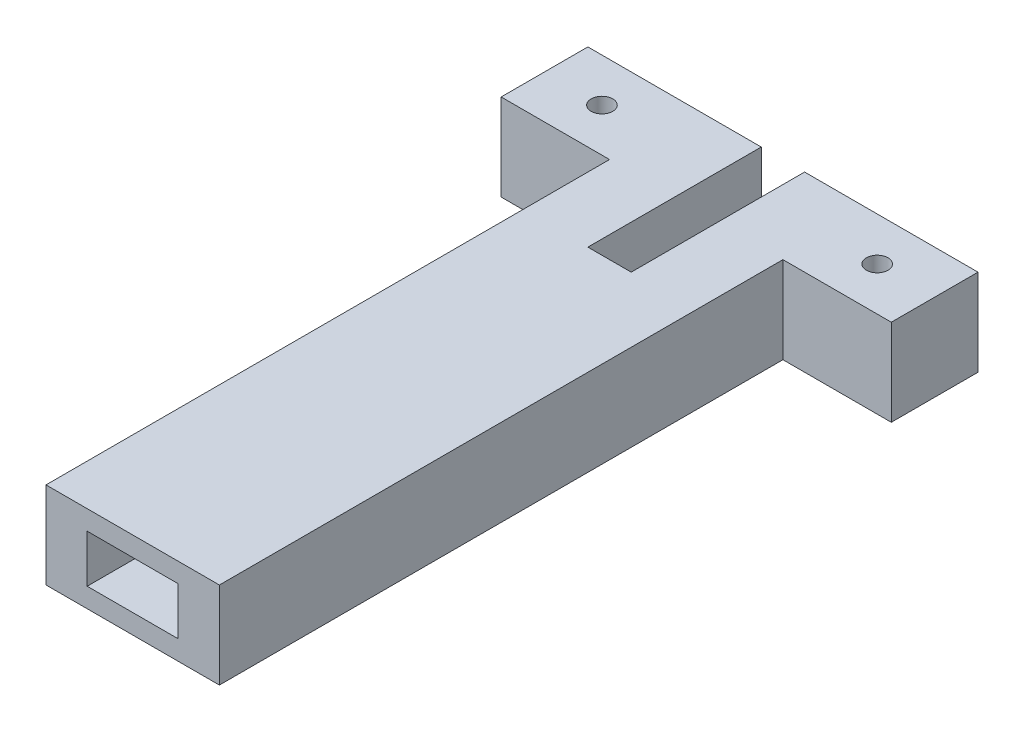
ISO-10303-21;
HEADER;
FILE_DESCRIPTION(('STEP AP214'),'2;1');
FILE_NAME('part.step','',(''),(''),'','','');
FILE_SCHEMA(('AUTOMOTIVE_DESIGN { 1 0 10303 214 1 1 1 1 }'));
ENDSEC;
DATA;
#1=APPLICATION_CONTEXT('core data for automotive mechanical design processes');
#2=APPLICATION_PROTOCOL_DEFINITION('international standard','automotive_design',2000,#1);
#3=PRODUCT_CONTEXT('',#1,'mechanical');
#4=PRODUCT('Part','Part','',(#3));
#5=PRODUCT_RELATED_PRODUCT_CATEGORY('part','',(#4));
#6=PRODUCT_DEFINITION_FORMATION('','',#4);
#7=PRODUCT_DEFINITION_CONTEXT('part definition',#1,'design');
#8=PRODUCT_DEFINITION('design','',#6,#7);
#9=PRODUCT_DEFINITION_SHAPE('','',#8);
#10=(LENGTH_UNIT() NAMED_UNIT(*) SI_UNIT(.MILLI.,.METRE.));
#11=(NAMED_UNIT(*) PLANE_ANGLE_UNIT() SI_UNIT($,.RADIAN.));
#12=(NAMED_UNIT(*) SI_UNIT($,.STERADIAN.) SOLID_ANGLE_UNIT());
#13=UNCERTAINTY_MEASURE_WITH_UNIT(LENGTH_MEASURE(1.E-05),#10,'distance_accuracy_value','');
#14=(GEOMETRIC_REPRESENTATION_CONTEXT(3) GLOBAL_UNCERTAINTY_ASSIGNED_CONTEXT((#13)) GLOBAL_UNIT_ASSIGNED_CONTEXT((#10,
#11,#12)) REPRESENTATION_CONTEXT('',''));
#15=CARTESIAN_POINT('',(0.,0.,0.));
#16=DIRECTION('',(0.,0.,1.));
#17=DIRECTION('',(1.,0.,0.));
#18=AXIS2_PLACEMENT_3D('',#15,#16,#17);
#19=CARTESIAN_POINT('',(-2.5,10.,15.));
#20=DIRECTION('',(0.,0.,1.));
#21=DIRECTION('',(1.,0.,0.));
#22=AXIS2_PLACEMENT_3D('',#19,#20,#21);
#23=PLANE('',#22);
#24=DIRECTION('',(0.,-1.,0.));
#25=VECTOR('',#24,1.);
#26=CARTESIAN_POINT('',(-2.5,10.,15.));
#27=LINE('',#26,#25);
#28=CARTESIAN_POINT('',(-2.5,2.25,15.));
#29=VERTEX_POINT('',#28);
#30=CARTESIAN_POINT('',(-2.5,0.,15.));
#31=VERTEX_POINT('',#30);
#32=EDGE_CURVE('E342',#29,#31,#27,.T.);
#33=ORIENTED_EDGE('',*,*,#32,.F.);
#34=DIRECTION('',(-1.,0.,0.));
#35=VECTOR('',#34,1.);
#36=CARTESIAN_POINT('',(-5.25,2.25,15.));
#37=LINE('',#36,#35);
#38=CARTESIAN_POINT('',(2.5,2.25,15.));
#39=VERTEX_POINT('',#38);
#40=EDGE_CURVE('E55',#39,#29,#37,.T.);
#41=ORIENTED_EDGE('',*,*,#40,.F.);
#42=DIRECTION('',(0.,-1.,0.));
#43=VECTOR('',#42,1.);
#44=CARTESIAN_POINT('',(2.5,10.,15.));
#45=LINE('',#44,#43);
#46=CARTESIAN_POINT('',(2.5,0.,15.));
#47=VERTEX_POINT('',#46);
#48=EDGE_CURVE('E346',#39,#47,#45,.T.);
#49=ORIENTED_EDGE('',*,*,#48,.T.);
#50=DIRECTION('',(-1.,0.,0.));
#51=VECTOR('',#50,1.);
#52=CARTESIAN_POINT('',(-2.5,0.,15.));
#53=LINE('',#52,#51);
#54=EDGE_CURVE('E277',#47,#31,#53,.T.);
#55=ORIENTED_EDGE('',*,*,#54,.T.);
#56=EDGE_LOOP('',(#33,#41,#49,#55));
#57=FACE_BOUND('',#56,.T.);
#58=ADVANCED_FACE('F39',(#57),#23,.F.);
#59=CARTESIAN_POINT('',(0.,10.,0.));
#60=DIRECTION('',(0.,1.,0.));
#61=DIRECTION('',(0.,0.,1.));
#62=AXIS2_PLACEMENT_3D('',#59,#60,#61);
#63=PLANE('',#62);
#64=CARTESIAN_POINT('',(-15.875,10.,0.));
#65=DIRECTION('',(0.,1.,0.));
#66=DIRECTION('',(0.,0.,1.));
#67=AXIS2_PLACEMENT_3D('',#64,#65,#66);
#68=CIRCLE('',#67,1.25);
#69=CARTESIAN_POINT('',(-15.875,10.,1.25));
#70=VERTEX_POINT('',#69);
#71=EDGE_CURVE('E223',#70,#70,#68,.T.);
#72=ORIENTED_EDGE('',*,*,#71,.F.);
#73=EDGE_LOOP('',(#72));
#74=FACE_BOUND('',#73,.T.);
#75=DIRECTION('',(-1.,0.,0.));
#76=VECTOR('',#75,1.);
#77=CARTESIAN_POINT('',(2.5,10.,-5.));
#78=LINE('',#77,#76);
#79=CARTESIAN_POINT('',(22.5,10.,-5.));
#80=VERTEX_POINT('',#79);
#81=CARTESIAN_POINT('',(2.5,10.,-5.));
#82=VERTEX_POINT('',#81);
#83=EDGE_CURVE('E231',#80,#82,#78,.T.);
#84=ORIENTED_EDGE('',*,*,#83,.T.);
#85=DIRECTION('',(0.,0.,1.));
#86=VECTOR('',#85,1.);
#87=CARTESIAN_POINT('',(2.5,10.,15.));
#88=LINE('',#87,#86);
#89=CARTESIAN_POINT('',(2.5,10.,15.));
#90=VERTEX_POINT('',#89);
#91=EDGE_CURVE('E235',#82,#90,#88,.T.);
#92=ORIENTED_EDGE('',*,*,#91,.T.);
#93=DIRECTION('',(-1.,0.,0.));
#94=VECTOR('',#93,1.);
#95=CARTESIAN_POINT('',(-2.5,10.,15.));
#96=LINE('',#95,#94);
#97=CARTESIAN_POINT('',(-2.5,10.,15.));
#98=VERTEX_POINT('',#97);
#99=EDGE_CURVE('E239',#90,#98,#96,.T.);
#100=ORIENTED_EDGE('',*,*,#99,.T.);
#101=DIRECTION('',(0.,0.,-1.));
#102=VECTOR('',#101,1.);
#103=CARTESIAN_POINT('',(-2.5,10.,15.));
#104=LINE('',#103,#102);
#105=CARTESIAN_POINT('',(-2.5,10.,-5.));
#106=VERTEX_POINT('',#105);
#107=EDGE_CURVE('E242',#98,#106,#104,.T.);
#108=ORIENTED_EDGE('',*,*,#107,.T.);
#109=DIRECTION('',(-1.,0.,0.));
#110=VECTOR('',#109,1.);
#111=CARTESIAN_POINT('',(-22.5,10.,-5.));
#112=LINE('',#111,#110);
#113=CARTESIAN_POINT('',(-22.5,10.,-5.));
#114=VERTEX_POINT('',#113);
#115=EDGE_CURVE('E245',#106,#114,#112,.T.);
#116=ORIENTED_EDGE('',*,*,#115,.T.);
#117=DIRECTION('',(0.,0.,1.));
#118=VECTOR('',#117,1.);
#119=CARTESIAN_POINT('',(-22.5,10.,5.));
#120=LINE('',#119,#118);
#121=CARTESIAN_POINT('',(-22.5,10.,5.));
#122=VERTEX_POINT('',#121);
#123=EDGE_CURVE('E248',#114,#122,#120,.T.);
#124=ORIENTED_EDGE('',*,*,#123,.T.);
#125=DIRECTION('',(1.,0.,0.));
#126=VECTOR('',#125,1.);
#127=CARTESIAN_POINT('',(-22.5,10.,5.));
#128=LINE('',#127,#126);
#129=CARTESIAN_POINT('',(-10.,10.,5.));
#130=VERTEX_POINT('',#129);
#131=EDGE_CURVE('E251',#122,#130,#128,.T.);
#132=ORIENTED_EDGE('',*,*,#131,.T.);
#133=DIRECTION('',(0.,0.,1.));
#134=VECTOR('',#133,1.);
#135=CARTESIAN_POINT('',(-10.,10.,70.));
#136=LINE('',#135,#134);
#137=CARTESIAN_POINT('',(-10.,10.,70.));
#138=VERTEX_POINT('',#137);
#139=EDGE_CURVE('E254',#130,#138,#136,.T.);
#140=ORIENTED_EDGE('',*,*,#139,.T.);
#141=DIRECTION('',(1.,0.,0.));
#142=VECTOR('',#141,1.);
#143=CARTESIAN_POINT('',(-10.,10.,70.));
#144=LINE('',#143,#142);
#145=CARTESIAN_POINT('',(10.,10.,70.));
#146=VERTEX_POINT('',#145);
#147=EDGE_CURVE('E257',#138,#146,#144,.T.);
#148=ORIENTED_EDGE('',*,*,#147,.T.);
#149=DIRECTION('',(0.,0.,-1.));
#150=VECTOR('',#149,1.);
#151=CARTESIAN_POINT('',(10.,10.,70.));
#152=LINE('',#151,#150);
#153=CARTESIAN_POINT('',(10.,10.,5.));
#154=VERTEX_POINT('',#153);
#155=EDGE_CURVE('E260',#146,#154,#152,.T.);
#156=ORIENTED_EDGE('',*,*,#155,.T.);
#157=DIRECTION('',(1.,0.,0.));
#158=VECTOR('',#157,1.);
#159=CARTESIAN_POINT('',(10.,10.,5.));
#160=LINE('',#159,#158);
#161=CARTESIAN_POINT('',(22.5,10.,5.));
#162=VERTEX_POINT('',#161);
#163=EDGE_CURVE('E263',#154,#162,#160,.T.);
#164=ORIENTED_EDGE('',*,*,#163,.T.);
#165=DIRECTION('',(0.,0.,-1.));
#166=VECTOR('',#165,1.);
#167=CARTESIAN_POINT('',(22.5,10.,5.));
#168=LINE('',#167,#166);
#169=EDGE_CURVE('E266',#162,#80,#168,.T.);
#170=ORIENTED_EDGE('',*,*,#169,.T.);
#171=EDGE_LOOP('',(#84,#92,#100,#108,#116,#124,#132,#140,#148,#156,#164,#170));
#172=FACE_BOUND('',#171,.T.);
#173=CARTESIAN_POINT('',(15.875,10.,0.));
#174=DIRECTION('',(0.,1.,0.));
#175=DIRECTION('',(0.,0.,1.));
#176=AXIS2_PLACEMENT_3D('',#173,#174,#175);
#177=CIRCLE('',#176,1.25);
#178=CARTESIAN_POINT('',(15.875,10.,1.25));
#179=VERTEX_POINT('',#178);
#180=EDGE_CURVE('E215',#179,#179,#177,.T.);
#181=ORIENTED_EDGE('',*,*,#180,.F.);
#182=EDGE_LOOP('',(#181));
#183=FACE_BOUND('',#182,.T.);
#184=ADVANCED_FACE('F381',(#74,#172,#183),#63,.T.);
#185=CARTESIAN_POINT('',(0.,0.,0.));
#186=DIRECTION('',(0.,1.,0.));
#187=DIRECTION('',(0.,0.,1.));
#188=AXIS2_PLACEMENT_3D('',#185,#186,#187);
#189=PLANE('',#188);
#190=DIRECTION('',(-1.,0.,0.));
#191=VECTOR('',#190,1.);
#192=CARTESIAN_POINT('',(2.5,0.,-5.));
#193=LINE('',#192,#191);
#194=CARTESIAN_POINT('',(22.5,0.,-5.));
#195=VERTEX_POINT('',#194);
#196=CARTESIAN_POINT('',(2.5,0.,-5.));
#197=VERTEX_POINT('',#196);
#198=EDGE_CURVE('E227',#195,#197,#193,.T.);
#199=ORIENTED_EDGE('',*,*,#198,.F.);
#200=DIRECTION('',(0.,0.,-1.));
#201=VECTOR('',#200,1.);
#202=CARTESIAN_POINT('',(22.5,0.,5.));
#203=LINE('',#202,#201);
#204=CARTESIAN_POINT('',(22.5,0.,5.));
#205=VERTEX_POINT('',#204);
#206=EDGE_CURVE('E236',#205,#195,#203,.T.);
#207=ORIENTED_EDGE('',*,*,#206,.F.);
#208=DIRECTION('',(1.,0.,0.));
#209=VECTOR('',#208,1.);
#210=CARTESIAN_POINT('',(10.,0.,5.));
#211=LINE('',#210,#209);
#212=CARTESIAN_POINT('',(10.,0.,5.));
#213=VERTEX_POINT('',#212);
#214=EDGE_CURVE('E302',#213,#205,#211,.T.);
#215=ORIENTED_EDGE('',*,*,#214,.F.);
#216=DIRECTION('',(0.,0.,-1.));
#217=VECTOR('',#216,1.);
#218=CARTESIAN_POINT('',(10.,0.,70.));
#219=LINE('',#218,#217);
#220=CARTESIAN_POINT('',(10.,0.,70.));
#221=VERTEX_POINT('',#220);
#222=EDGE_CURVE('E299',#221,#213,#219,.T.);
#223=ORIENTED_EDGE('',*,*,#222,.F.);
#224=DIRECTION('',(1.,0.,0.));
#225=VECTOR('',#224,1.);
#226=CARTESIAN_POINT('',(-10.,0.,70.));
#227=LINE('',#226,#225);
#228=CARTESIAN_POINT('',(-10.,0.,70.));
#229=VERTEX_POINT('',#228);
#230=EDGE_CURVE('E296',#229,#221,#227,.T.);
#231=ORIENTED_EDGE('',*,*,#230,.F.);
#232=DIRECTION('',(0.,0.,1.));
#233=VECTOR('',#232,1.);
#234=CARTESIAN_POINT('',(-10.,0.,70.));
#235=LINE('',#234,#233);
#236=CARTESIAN_POINT('',(-10.,0.,5.));
#237=VERTEX_POINT('',#236);
#238=EDGE_CURVE('E293',#237,#229,#235,.T.);
#239=ORIENTED_EDGE('',*,*,#238,.F.);
#240=DIRECTION('',(1.,0.,0.));
#241=VECTOR('',#240,1.);
#242=CARTESIAN_POINT('',(-22.5,0.,5.));
#243=LINE('',#242,#241);
#244=CARTESIAN_POINT('',(-22.5,0.,5.));
#245=VERTEX_POINT('',#244);
#246=EDGE_CURVE('E290',#245,#237,#243,.T.);
#247=ORIENTED_EDGE('',*,*,#246,.F.);
#248=DIRECTION('',(0.,0.,1.));
#249=VECTOR('',#248,1.);
#250=CARTESIAN_POINT('',(-22.5,0.,5.));
#251=LINE('',#250,#249);
#252=CARTESIAN_POINT('',(-22.5,0.,-5.));
#253=VERTEX_POINT('',#252);
#254=EDGE_CURVE('E287',#253,#245,#251,.T.);
#255=ORIENTED_EDGE('',*,*,#254,.F.);
#256=DIRECTION('',(-1.,0.,0.));
#257=VECTOR('',#256,1.);
#258=CARTESIAN_POINT('',(-22.5,0.,-5.));
#259=LINE('',#258,#257);
#260=CARTESIAN_POINT('',(-2.5,0.,-5.));
#261=VERTEX_POINT('',#260);
#262=EDGE_CURVE('E284',#261,#253,#259,.T.);
#263=ORIENTED_EDGE('',*,*,#262,.F.);
#264=DIRECTION('',(0.,0.,-1.));
#265=VECTOR('',#264,1.);
#266=CARTESIAN_POINT('',(-2.5,0.,15.));
#267=LINE('',#266,#265);
#268=EDGE_CURVE('E281',#31,#261,#267,.T.);
#269=ORIENTED_EDGE('',*,*,#268,.F.);
#270=ORIENTED_EDGE('',*,*,#54,.F.);
#271=DIRECTION('',(0.,0.,1.));
#272=VECTOR('',#271,1.);
#273=CARTESIAN_POINT('',(2.5,0.,15.));
#274=LINE('',#273,#272);
#275=EDGE_CURVE('E273',#197,#47,#274,.T.);
#276=ORIENTED_EDGE('',*,*,#275,.F.);
#277=EDGE_LOOP('',(#199,#207,#215,#223,#231,#239,#247,#255,#263,#269,#270,#276));
#278=FACE_BOUND('',#277,.T.);
#279=CARTESIAN_POINT('',(-15.875,0.,0.));
#280=DIRECTION('',(0.,1.,0.));
#281=DIRECTION('',(0.,0.,1.));
#282=AXIS2_PLACEMENT_3D('',#279,#280,#281);
#283=CIRCLE('',#282,1.25);
#284=CARTESIAN_POINT('',(-15.875,0.,1.25));
#285=VERTEX_POINT('',#284);
#286=EDGE_CURVE('E219',#285,#285,#283,.T.);
#287=ORIENTED_EDGE('',*,*,#286,.T.);
#288=EDGE_LOOP('',(#287));
#289=FACE_BOUND('',#288,.T.);
#290=CARTESIAN_POINT('',(15.875,0.,0.));
#291=DIRECTION('',(0.,1.,0.));
#292=DIRECTION('',(0.,0.,1.));
#293=AXIS2_PLACEMENT_3D('',#290,#291,#292);
#294=CIRCLE('',#293,1.25);
#295=CARTESIAN_POINT('',(15.875,0.,1.25));
#296=VERTEX_POINT('',#295);
#297=EDGE_CURVE('E214',#296,#296,#294,.T.);
#298=ORIENTED_EDGE('',*,*,#297,.T.);
#299=EDGE_LOOP('',(#298));
#300=FACE_BOUND('',#299,.T.);
#301=ADVANCED_FACE('F366',(#278,#289,#300),#189,.F.);
#302=CARTESIAN_POINT('',(2.5,10.,-5.));
#303=DIRECTION('',(0.,0.,1.));
#304=DIRECTION('',(1.,0.,0.));
#305=AXIS2_PLACEMENT_3D('',#302,#303,#304);
#306=PLANE('',#305);
#307=ORIENTED_EDGE('',*,*,#198,.T.);
#308=DIRECTION('',(0.,-1.,0.));
#309=VECTOR('',#308,1.);
#310=CARTESIAN_POINT('',(2.5,10.,-5.));
#311=LINE('',#310,#309);
#312=EDGE_CURVE('E11',#82,#197,#311,.T.);
#313=ORIENTED_EDGE('',*,*,#312,.F.);
#314=ORIENTED_EDGE('',*,*,#83,.F.);
#315=DIRECTION('',(0.,-1.,0.));
#316=VECTOR('',#315,1.);
#317=CARTESIAN_POINT('',(22.5,10.,-5.));
#318=LINE('',#317,#316);
#319=EDGE_CURVE('E269',#80,#195,#318,.T.);
#320=ORIENTED_EDGE('',*,*,#319,.T.);
#321=EDGE_LOOP('',(#307,#313,#314,#320));
#322=FACE_BOUND('',#321,.T.);
#323=ADVANCED_FACE('F41',(#322),#306,.F.);
#324=CARTESIAN_POINT('',(2.5,10.,15.));
#325=DIRECTION('',(1.,0.,0.));
#326=DIRECTION('',(0.,0.,-1.));
#327=AXIS2_PLACEMENT_3D('',#324,#325,#326);
#328=PLANE('',#327);
#329=ORIENTED_EDGE('',*,*,#275,.T.);
#330=ORIENTED_EDGE('',*,*,#48,.F.);
#331=DIRECTION('',(0.,-1.,0.));
#332=VECTOR('',#331,1.);
#333=CARTESIAN_POINT('',(2.5,10.,15.));
#334=LINE('',#333,#332);
#335=CARTESIAN_POINT('',(2.5,7.75,15.));
#336=VERTEX_POINT('',#335);
#337=EDGE_CURVE('E209',#336,#39,#334,.T.);
#338=ORIENTED_EDGE('',*,*,#337,.F.);
#339=EDGE_CURVE('E48',#90,#336,#45,.T.);
#340=ORIENTED_EDGE('',*,*,#339,.F.);
#341=ORIENTED_EDGE('',*,*,#91,.F.);
#342=ORIENTED_EDGE('',*,*,#312,.T.);
#343=EDGE_LOOP('',(#329,#330,#338,#340,#341,#342));
#344=FACE_BOUND('',#343,.T.);
#345=ADVANCED_FACE('F362',(#344),#328,.F.);
#346=ORIENTED_EDGE('',*,*,#339,.T.);
#347=DIRECTION('',(1.,0.,0.));
#348=VECTOR('',#347,1.);
#349=CARTESIAN_POINT('',(-5.25,7.75,15.));
#350=LINE('',#349,#348);
#351=CARTESIAN_POINT('',(-2.5,7.75,15.));
#352=VERTEX_POINT('',#351);
#353=EDGE_CURVE('E210',#352,#336,#350,.T.);
#354=ORIENTED_EDGE('',*,*,#353,.F.);
#355=EDGE_CURVE('E343',#98,#352,#27,.T.);
#356=ORIENTED_EDGE('',*,*,#355,.F.);
#357=ORIENTED_EDGE('',*,*,#99,.F.);
#358=EDGE_LOOP('',(#346,#354,#356,#357));
#359=FACE_BOUND('',#358,.T.);
#360=ADVANCED_FACE('F385',(#359),#23,.F.);
#361=CARTESIAN_POINT('',(-2.5,10.,15.));
#362=DIRECTION('',(-1.,0.,0.));
#363=DIRECTION('',(0.,0.,1.));
#364=AXIS2_PLACEMENT_3D('',#361,#362,#363);
#365=PLANE('',#364);
#366=ORIENTED_EDGE('',*,*,#268,.T.);
#367=DIRECTION('',(0.,-1.,0.));
#368=VECTOR('',#367,1.);
#369=CARTESIAN_POINT('',(-2.5,10.,-5.));
#370=LINE('',#369,#368);
#371=EDGE_CURVE('E338',#106,#261,#370,.T.);
#372=ORIENTED_EDGE('',*,*,#371,.F.);
#373=ORIENTED_EDGE('',*,*,#107,.F.);
#374=ORIENTED_EDGE('',*,*,#355,.T.);
#375=EDGE_CURVE('E347',#352,#29,#27,.T.);
#376=ORIENTED_EDGE('',*,*,#375,.T.);
#377=ORIENTED_EDGE('',*,*,#32,.T.);
#378=EDGE_LOOP('',(#366,#372,#373,#374,#376,#377));
#379=FACE_BOUND('',#378,.T.);
#380=ADVANCED_FACE('F372',(#379),#365,.F.);
#381=CARTESIAN_POINT('',(-22.5,10.,-5.));
#382=DIRECTION('',(0.,0.,1.));
#383=DIRECTION('',(1.,0.,0.));
#384=AXIS2_PLACEMENT_3D('',#381,#382,#383);
#385=PLANE('',#384);
#386=ORIENTED_EDGE('',*,*,#262,.T.);
#387=DIRECTION('',(0.,-1.,0.));
#388=VECTOR('',#387,1.);
#389=CARTESIAN_POINT('',(-22.5,10.,-5.));
#390=LINE('',#389,#388);
#391=EDGE_CURVE('E334',#114,#253,#390,.T.);
#392=ORIENTED_EDGE('',*,*,#391,.F.);
#393=ORIENTED_EDGE('',*,*,#115,.F.);
#394=ORIENTED_EDGE('',*,*,#371,.T.);
#395=EDGE_LOOP('',(#386,#392,#393,#394));
#396=FACE_BOUND('',#395,.T.);
#397=ADVANCED_FACE('F377',(#396),#385,.F.);
#398=CARTESIAN_POINT('',(-22.5,10.,5.));
#399=DIRECTION('',(1.,0.,0.));
#400=DIRECTION('',(0.,0.,-1.));
#401=AXIS2_PLACEMENT_3D('',#398,#399,#400);
#402=PLANE('',#401);
#403=ORIENTED_EDGE('',*,*,#254,.T.);
#404=DIRECTION('',(0.,-1.,0.));
#405=VECTOR('',#404,1.);
#406=CARTESIAN_POINT('',(-22.5,10.,5.));
#407=LINE('',#406,#405);
#408=EDGE_CURVE('E330',#122,#245,#407,.T.);
#409=ORIENTED_EDGE('',*,*,#408,.F.);
#410=ORIENTED_EDGE('',*,*,#123,.F.);
#411=ORIENTED_EDGE('',*,*,#391,.T.);
#412=EDGE_LOOP('',(#403,#409,#410,#411));
#413=FACE_BOUND('',#412,.T.);
#414=ADVANCED_FACE('F471',(#413),#402,.F.);
#415=CARTESIAN_POINT('',(-22.5,10.,5.));
#416=DIRECTION('',(0.,0.,-1.));
#417=DIRECTION('',(-1.,0.,0.));
#418=AXIS2_PLACEMENT_3D('',#415,#416,#417);
#419=PLANE('',#418);
#420=ORIENTED_EDGE('',*,*,#246,.T.);
#421=DIRECTION('',(0.,-1.,0.));
#422=VECTOR('',#421,1.);
#423=CARTESIAN_POINT('',(-10.,10.,5.));
#424=LINE('',#423,#422);
#425=EDGE_CURVE('E326',#130,#237,#424,.T.);
#426=ORIENTED_EDGE('',*,*,#425,.F.);
#427=ORIENTED_EDGE('',*,*,#131,.F.);
#428=ORIENTED_EDGE('',*,*,#408,.T.);
#429=EDGE_LOOP('',(#420,#426,#427,#428));
#430=FACE_BOUND('',#429,.T.);
#431=ADVANCED_FACE('F469',(#430),#419,.F.);
#432=CARTESIAN_POINT('',(-10.,10.,70.));
#433=DIRECTION('',(1.,0.,0.));
#434=DIRECTION('',(0.,0.,-1.));
#435=AXIS2_PLACEMENT_3D('',#432,#433,#434);
#436=PLANE('',#435);
#437=ORIENTED_EDGE('',*,*,#238,.T.);
#438=DIRECTION('',(0.,-1.,0.));
#439=VECTOR('',#438,1.);
#440=CARTESIAN_POINT('',(-10.,10.,70.));
#441=LINE('',#440,#439);
#442=EDGE_CURVE('E322',#138,#229,#441,.T.);
#443=ORIENTED_EDGE('',*,*,#442,.F.);
#444=ORIENTED_EDGE('',*,*,#139,.F.);
#445=ORIENTED_EDGE('',*,*,#425,.T.);
#446=EDGE_LOOP('',(#437,#443,#444,#445));
#447=FACE_BOUND('',#446,.T.);
#448=ADVANCED_FACE('F465',(#447),#436,.F.);
#449=CARTESIAN_POINT('',(-10.,10.,70.));
#450=DIRECTION('',(0.,0.,-1.));
#451=DIRECTION('',(-1.,0.,0.));
#452=AXIS2_PLACEMENT_3D('',#449,#450,#451);
#453=PLANE('',#452);
#454=DIRECTION('',(-1.,0.,0.));
#455=VECTOR('',#454,1.);
#456=CARTESIAN_POINT('',(-5.25,7.75,70.));
#457=LINE('',#456,#455);
#458=CARTESIAN_POINT('',(5.25,7.75,70.));
#459=VERTEX_POINT('',#458);
#460=CARTESIAN_POINT('',(-5.25,7.75,70.));
#461=VERTEX_POINT('',#460);
#462=EDGE_CURVE('E184',#459,#461,#457,.T.);
#463=ORIENTED_EDGE('',*,*,#462,.F.);
#464=DIRECTION('',(0.,1.,0.));
#465=VECTOR('',#464,1.);
#466=CARTESIAN_POINT('',(5.25,2.25,70.));
#467=LINE('',#466,#465);
#468=CARTESIAN_POINT('',(5.25,2.25,70.));
#469=VERTEX_POINT('',#468);
#470=EDGE_CURVE('E63',#469,#459,#467,.T.);
#471=ORIENTED_EDGE('',*,*,#470,.F.);
#472=DIRECTION('',(1.,0.,0.));
#473=VECTOR('',#472,1.);
#474=CARTESIAN_POINT('',(-5.25,2.25,70.));
#475=LINE('',#474,#473);
#476=CARTESIAN_POINT('',(-5.25,2.25,70.));
#477=VERTEX_POINT('',#476);
#478=EDGE_CURVE('E192',#477,#469,#475,.T.);
#479=ORIENTED_EDGE('',*,*,#478,.F.);
#480=DIRECTION('',(0.,-1.,0.));
#481=VECTOR('',#480,1.);
#482=CARTESIAN_POINT('',(-5.25,2.25,70.));
#483=LINE('',#482,#481);
#484=EDGE_CURVE('E172',#461,#477,#483,.T.);
#485=ORIENTED_EDGE('',*,*,#484,.F.);
#486=EDGE_LOOP('',(#463,#471,#479,#485));
#487=FACE_BOUND('',#486,.T.);
#488=ORIENTED_EDGE('',*,*,#230,.T.);
#489=DIRECTION('',(0.,-1.,0.));
#490=VECTOR('',#489,1.);
#491=CARTESIAN_POINT('',(10.,10.,70.));
#492=LINE('',#491,#490);
#493=EDGE_CURVE('E318',#146,#221,#492,.T.);
#494=ORIENTED_EDGE('',*,*,#493,.F.);
#495=ORIENTED_EDGE('',*,*,#147,.F.);
#496=ORIENTED_EDGE('',*,*,#442,.T.);
#497=EDGE_LOOP('',(#488,#494,#495,#496));
#498=FACE_BOUND('',#497,.T.);
#499=ADVANCED_FACE('F189',(#487,#498),#453,.F.);
#500=CARTESIAN_POINT('',(10.,10.,70.));
#501=DIRECTION('',(-1.,0.,0.));
#502=DIRECTION('',(0.,0.,1.));
#503=AXIS2_PLACEMENT_3D('',#500,#501,#502);
#504=PLANE('',#503);
#505=ORIENTED_EDGE('',*,*,#222,.T.);
#506=DIRECTION('',(0.,-1.,0.));
#507=VECTOR('',#506,1.);
#508=CARTESIAN_POINT('',(10.,10.,5.));
#509=LINE('',#508,#507);
#510=EDGE_CURVE('E314',#154,#213,#509,.T.);
#511=ORIENTED_EDGE('',*,*,#510,.F.);
#512=ORIENTED_EDGE('',*,*,#155,.F.);
#513=ORIENTED_EDGE('',*,*,#493,.T.);
#514=EDGE_LOOP('',(#505,#511,#512,#513));
#515=FACE_BOUND('',#514,.T.);
#516=ADVANCED_FACE('F456',(#515),#504,.F.);
#517=CARTESIAN_POINT('',(10.,10.,5.));
#518=DIRECTION('',(0.,0.,-1.));
#519=DIRECTION('',(-1.,0.,0.));
#520=AXIS2_PLACEMENT_3D('',#517,#518,#519);
#521=PLANE('',#520);
#522=ORIENTED_EDGE('',*,*,#214,.T.);
#523=DIRECTION('',(0.,-1.,0.));
#524=VECTOR('',#523,1.);
#525=CARTESIAN_POINT('',(22.5,10.,5.));
#526=LINE('',#525,#524);
#527=EDGE_CURVE('E310',#162,#205,#526,.T.);
#528=ORIENTED_EDGE('',*,*,#527,.F.);
#529=ORIENTED_EDGE('',*,*,#163,.F.);
#530=ORIENTED_EDGE('',*,*,#510,.T.);
#531=EDGE_LOOP('',(#522,#528,#529,#530));
#532=FACE_BOUND('',#531,.T.);
#533=ADVANCED_FACE('F452',(#532),#521,.F.);
#534=CARTESIAN_POINT('',(22.5,10.,5.));
#535=DIRECTION('',(-1.,0.,0.));
#536=DIRECTION('',(0.,0.,1.));
#537=AXIS2_PLACEMENT_3D('',#534,#535,#536);
#538=PLANE('',#537);
#539=ORIENTED_EDGE('',*,*,#206,.T.);
#540=ORIENTED_EDGE('',*,*,#319,.F.);
#541=ORIENTED_EDGE('',*,*,#169,.F.);
#542=ORIENTED_EDGE('',*,*,#527,.T.);
#543=EDGE_LOOP('',(#539,#540,#541,#542));
#544=FACE_BOUND('',#543,.T.);
#545=ADVANCED_FACE('F447',(#544),#538,.F.);
#546=CARTESIAN_POINT('',(-15.875,10.,0.));
#547=DIRECTION('',(0.,-1.,0.));
#548=DIRECTION('',(0.,0.,-1.));
#549=AXIS2_PLACEMENT_3D('',#546,#547,#548);
#550=CYLINDRICAL_SURFACE('',#549,1.25);
#551=ORIENTED_EDGE('',*,*,#71,.T.);
#552=EDGE_LOOP('',(#551));
#553=FACE_BOUND('',#552,.T.);
#554=ORIENTED_EDGE('',*,*,#286,.F.);
#555=EDGE_LOOP('',(#554));
#556=FACE_BOUND('',#555,.T.);
#557=ADVANCED_FACE('F490',(#553,#556),#550,.F.);
#558=CARTESIAN_POINT('',(15.875,10.,0.));
#559=DIRECTION('',(0.,-1.,0.));
#560=DIRECTION('',(0.,0.,-1.));
#561=AXIS2_PLACEMENT_3D('',#558,#559,#560);
#562=CYLINDRICAL_SURFACE('',#561,1.25);
#563=ORIENTED_EDGE('',*,*,#180,.T.);
#564=EDGE_LOOP('',(#563));
#565=FACE_BOUND('',#564,.T.);
#566=ORIENTED_EDGE('',*,*,#297,.F.);
#567=EDGE_LOOP('',(#566));
#568=FACE_BOUND('',#567,.T.);
#569=ADVANCED_FACE('F417',(#565,#568),#562,.F.);
#570=CARTESIAN_POINT('',(-2.5,10.,15.));
#571=DIRECTION('',(0.,0.,1.));
#572=DIRECTION('',(1.,0.,0.));
#573=AXIS2_PLACEMENT_3D('',#570,#571,#572);
#574=PLANE('',#573);
#575=ORIENTED_EDGE('',*,*,#337,.T.);
#576=CARTESIAN_POINT('',(5.25,2.25,15.));
#577=VERTEX_POINT('',#576);
#578=EDGE_CURVE('E392',#577,#39,#37,.T.);
#579=ORIENTED_EDGE('',*,*,#578,.F.);
#580=DIRECTION('',(0.,-1.,0.));
#581=VECTOR('',#580,1.);
#582=CARTESIAN_POINT('',(5.25,2.25,15.));
#583=LINE('',#582,#581);
#584=CARTESIAN_POINT('',(5.25,7.75,15.));
#585=VERTEX_POINT('',#584);
#586=EDGE_CURVE('E389',#585,#577,#583,.T.);
#587=ORIENTED_EDGE('',*,*,#586,.F.);
#588=EDGE_CURVE('E211',#336,#585,#350,.T.);
#589=ORIENTED_EDGE('',*,*,#588,.F.);
#590=EDGE_LOOP('',(#575,#579,#587,#589));
#591=FACE_BOUND('',#590,.T.);
#592=ADVANCED_FACE('F410',(#591),#574,.T.);
#593=ORIENTED_EDGE('',*,*,#375,.F.);
#594=CARTESIAN_POINT('',(-5.25,7.75,15.));
#595=VERTEX_POINT('',#594);
#596=EDGE_CURVE('E206',#595,#352,#350,.T.);
#597=ORIENTED_EDGE('',*,*,#596,.F.);
#598=DIRECTION('',(0.,1.,0.));
#599=VECTOR('',#598,1.);
#600=CARTESIAN_POINT('',(-5.25,2.25,15.));
#601=LINE('',#600,#599);
#602=CARTESIAN_POINT('',(-5.25,2.25,15.));
#603=VERTEX_POINT('',#602);
#604=EDGE_CURVE('E175',#603,#595,#601,.T.);
#605=ORIENTED_EDGE('',*,*,#604,.F.);
#606=EDGE_CURVE('E397',#29,#603,#37,.T.);
#607=ORIENTED_EDGE('',*,*,#606,.F.);
#608=EDGE_LOOP('',(#593,#597,#605,#607));
#609=FACE_BOUND('',#608,.T.);
#610=ADVANCED_FACE('F405',(#609),#574,.T.);
#611=CARTESIAN_POINT('',(5.25,2.25,3.14673040887031));
#612=DIRECTION('',(1.,0.,0.));
#613=DIRECTION('',(0.,0.,-1.));
#614=AXIS2_PLACEMENT_3D('',#611,#612,#613);
#615=PLANE('',#614);
#616=ORIENTED_EDGE('',*,*,#586,.T.);
#617=DIRECTION('',(0.,0.,1.));
#618=VECTOR('',#617,1.);
#619=CARTESIAN_POINT('',(5.25,2.25,3.14673040887031));
#620=LINE('',#619,#618);
#621=EDGE_CURVE('E199',#577,#469,#620,.T.);
#622=ORIENTED_EDGE('',*,*,#621,.T.);
#623=ORIENTED_EDGE('',*,*,#470,.T.);
#624=DIRECTION('',(0.,0.,1.));
#625=VECTOR('',#624,1.);
#626=CARTESIAN_POINT('',(5.25,7.75,3.14673040887031));
#627=LINE('',#626,#625);
#628=EDGE_CURVE('E181',#585,#459,#627,.T.);
#629=ORIENTED_EDGE('',*,*,#628,.F.);
#630=EDGE_LOOP('',(#616,#622,#623,#629));
#631=FACE_BOUND('',#630,.T.);
#632=ADVANCED_FACE('F409',(#631),#615,.F.);
#633=CARTESIAN_POINT('',(-5.25,2.25,3.14673040887031));
#634=DIRECTION('',(0.,-1.,0.));
#635=DIRECTION('',(0.,0.,-1.));
#636=AXIS2_PLACEMENT_3D('',#633,#634,#635);
#637=PLANE('',#636);
#638=ORIENTED_EDGE('',*,*,#578,.T.);
#639=ORIENTED_EDGE('',*,*,#40,.T.);
#640=ORIENTED_EDGE('',*,*,#606,.T.);
#641=DIRECTION('',(0.,0.,1.));
#642=VECTOR('',#641,1.);
#643=CARTESIAN_POINT('',(-5.25,2.25,3.14673040887031));
#644=LINE('',#643,#642);
#645=EDGE_CURVE('E180',#603,#477,#644,.T.);
#646=ORIENTED_EDGE('',*,*,#645,.T.);
#647=ORIENTED_EDGE('',*,*,#478,.T.);
#648=ORIENTED_EDGE('',*,*,#621,.F.);
#649=EDGE_LOOP('',(#638,#639,#640,#646,#647,#648));
#650=FACE_BOUND('',#649,.T.);
#651=ADVANCED_FACE('F403',(#650),#637,.F.);
#652=CARTESIAN_POINT('',(-5.25,2.25,3.14673040887031));
#653=DIRECTION('',(-1.,0.,0.));
#654=DIRECTION('',(0.,0.,1.));
#655=AXIS2_PLACEMENT_3D('',#652,#653,#654);
#656=PLANE('',#655);
#657=ORIENTED_EDGE('',*,*,#604,.T.);
#658=DIRECTION('',(0.,0.,1.));
#659=VECTOR('',#658,1.);
#660=CARTESIAN_POINT('',(-5.25,7.75,3.14673040887031));
#661=LINE('',#660,#659);
#662=EDGE_CURVE('E167',#595,#461,#661,.T.);
#663=ORIENTED_EDGE('',*,*,#662,.T.);
#664=ORIENTED_EDGE('',*,*,#484,.T.);
#665=ORIENTED_EDGE('',*,*,#645,.F.);
#666=EDGE_LOOP('',(#657,#663,#664,#665));
#667=FACE_BOUND('',#666,.T.);
#668=ADVANCED_FACE('F169',(#667),#656,.F.);
#669=CARTESIAN_POINT('',(-5.25,7.75,3.14673040887031));
#670=DIRECTION('',(0.,1.,0.));
#671=DIRECTION('',(0.,0.,1.));
#672=AXIS2_PLACEMENT_3D('',#669,#670,#671);
#673=PLANE('',#672);
#674=ORIENTED_EDGE('',*,*,#596,.T.);
#675=ORIENTED_EDGE('',*,*,#353,.T.);
#676=ORIENTED_EDGE('',*,*,#588,.T.);
#677=ORIENTED_EDGE('',*,*,#628,.T.);
#678=ORIENTED_EDGE('',*,*,#462,.T.);
#679=ORIENTED_EDGE('',*,*,#662,.F.);
#680=EDGE_LOOP('',(#674,#675,#676,#677,#678,#679));
#681=FACE_BOUND('',#680,.T.);
#682=ADVANCED_FACE('F185',(#681),#673,.F.);
#683=CLOSED_SHELL('',(#58,#184,#301,#323,#345,#360,#380,#397,#414,#431,#448,#499,#516,#533,#545,
#557,#569,#592,#610,#632,#651,#668,#682));
#684=MANIFOLD_SOLID_BREP('B2',#683);
#685=ADVANCED_BREP_SHAPE_REPRESENTATION('',(#18,#684),#14);
#686=SHAPE_DEFINITION_REPRESENTATION(#9,#685);
ENDSEC;
END-ISO-10303-21;
